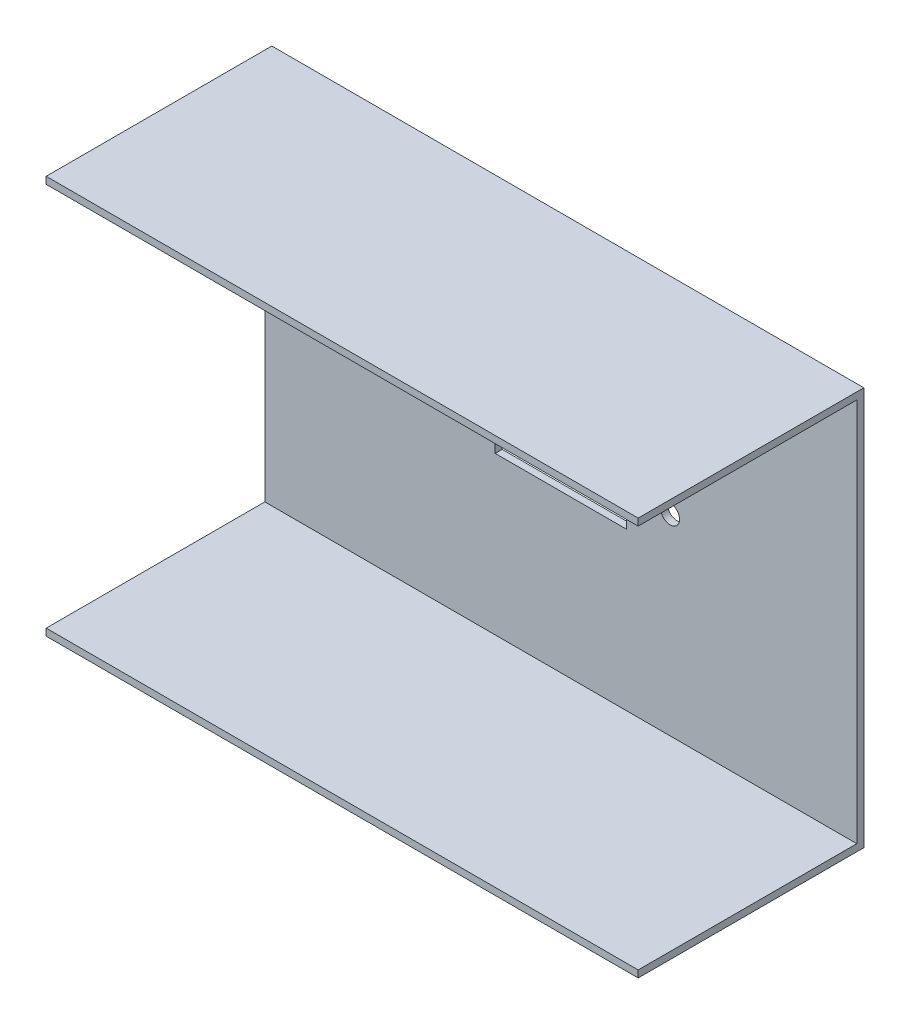
ISO-10303-21;
HEADER;
FILE_DESCRIPTION(('STEP AP214'),'2;1');
FILE_NAME('part.step','',(''),(''),'','','');
FILE_SCHEMA(('AUTOMOTIVE_DESIGN { 1 0 10303 214 1 1 1 1 }'));
ENDSEC;
DATA;
#1=APPLICATION_CONTEXT('core data for automotive mechanical design processes');
#2=APPLICATION_PROTOCOL_DEFINITION('international standard','automotive_design',2000,#1);
#3=PRODUCT_CONTEXT('',#1,'mechanical');
#4=PRODUCT('Part','Part','',(#3));
#5=PRODUCT_RELATED_PRODUCT_CATEGORY('part','',(#4));
#6=PRODUCT_DEFINITION_FORMATION('','',#4);
#7=PRODUCT_DEFINITION_CONTEXT('part definition',#1,'design');
#8=PRODUCT_DEFINITION('design','',#6,#7);
#9=PRODUCT_DEFINITION_SHAPE('','',#8);
#10=(LENGTH_UNIT() NAMED_UNIT(*) SI_UNIT(.MILLI.,.METRE.));
#11=(NAMED_UNIT(*) PLANE_ANGLE_UNIT() SI_UNIT($,.RADIAN.));
#12=(NAMED_UNIT(*) SI_UNIT($,.STERADIAN.) SOLID_ANGLE_UNIT());
#13=UNCERTAINTY_MEASURE_WITH_UNIT(LENGTH_MEASURE(1.E-05),#10,'distance_accuracy_value','');
#14=(GEOMETRIC_REPRESENTATION_CONTEXT(3) GLOBAL_UNCERTAINTY_ASSIGNED_CONTEXT((#13)) GLOBAL_UNIT_ASSIGNED_CONTEXT((#10,
#11,#12)) REPRESENTATION_CONTEXT('',''));
#15=CARTESIAN_POINT('',(0.,0.,0.));
#16=DIRECTION('',(0.,0.,1.));
#17=DIRECTION('',(1.,0.,0.));
#18=AXIS2_PLACEMENT_3D('',#15,#16,#17);
#19=CARTESIAN_POINT('',(135.3879,0.,-51.6002));
#20=DIRECTION('',(0.,-1.,0.));
#21=DIRECTION('',(0.,0.,-1.));
#22=AXIS2_PLACEMENT_3D('',#19,#20,#21);
#23=PLANE('',#22);
#24=DIRECTION('',(0.,0.,1.));
#25=VECTOR('',#24,1.);
#26=CARTESIAN_POINT('',(0.,0.,-51.6002));
#27=LINE('',#26,#25);
#28=CARTESIAN_POINT('',(0.,0.,-51.6002));
#29=VERTEX_POINT('',#28);
#30=CARTESIAN_POINT('',(0.,0.,0.));
#31=VERTEX_POINT('',#30);
#32=EDGE_CURVE('E159',#29,#31,#27,.T.);
#33=ORIENTED_EDGE('',*,*,#32,.T.);
#34=DIRECTION('',(-1.,0.,0.));
#35=VECTOR('',#34,1.);
#36=CARTESIAN_POINT('',(135.3879,0.,0.));
#37=LINE('',#36,#35);
#38=CARTESIAN_POINT('',(135.3879,0.,0.));
#39=VERTEX_POINT('',#38);
#40=EDGE_CURVE('E11',#39,#31,#37,.T.);
#41=ORIENTED_EDGE('',*,*,#40,.F.);
#42=DIRECTION('',(0.,0.,1.));
#43=VECTOR('',#42,1.);
#44=CARTESIAN_POINT('',(135.3879,0.,-51.6002));
#45=LINE('',#44,#43);
#46=CARTESIAN_POINT('',(135.3879,0.,-51.6002));
#47=VERTEX_POINT('',#46);
#48=EDGE_CURVE('E161',#47,#39,#45,.T.);
#49=ORIENTED_EDGE('',*,*,#48,.F.);
#50=DIRECTION('',(-1.,0.,0.));
#51=VECTOR('',#50,1.);
#52=CARTESIAN_POINT('',(135.3879,0.,-51.6002));
#53=LINE('',#52,#51);
#54=EDGE_CURVE('E179',#47,#29,#53,.T.);
#55=ORIENTED_EDGE('',*,*,#54,.T.);
#56=EDGE_LOOP('',(#33,#41,#49,#55));
#57=FACE_BOUND('',#56,.T.);
#58=ADVANCED_FACE('F41',(#57),#23,.F.);
#59=CARTESIAN_POINT('',(135.3879,0.,0.));
#60=DIRECTION('',(0.,0.,-1.));
#61=DIRECTION('',(0.,1.,0.));
#62=AXIS2_PLACEMENT_3D('',#59,#60,#61);
#63=PLANE('',#62);
#64=DIRECTION('',(0.,-1.,0.));
#65=VECTOR('',#64,1.);
#66=CARTESIAN_POINT('',(0.,0.,0.));
#67=LINE('',#66,#65);
#68=CARTESIAN_POINT('',(0.,-1.6002,0.));
#69=VERTEX_POINT('',#68);
#70=EDGE_CURVE('E182',#31,#69,#67,.T.);
#71=ORIENTED_EDGE('',*,*,#70,.T.);
#72=DIRECTION('',(-1.,0.,0.));
#73=VECTOR('',#72,1.);
#74=CARTESIAN_POINT('',(135.3879,-1.6002,0.));
#75=LINE('',#74,#73);
#76=CARTESIAN_POINT('',(135.3879,-1.6002,0.));
#77=VERTEX_POINT('',#76);
#78=EDGE_CURVE('E48',#77,#69,#75,.T.);
#79=ORIENTED_EDGE('',*,*,#78,.F.);
#80=DIRECTION('',(0.,-1.,0.));
#81=VECTOR('',#80,1.);
#82=CARTESIAN_POINT('',(135.3879,0.,0.));
#83=LINE('',#82,#81);
#84=EDGE_CURVE('E164',#39,#77,#83,.T.);
#85=ORIENTED_EDGE('',*,*,#84,.F.);
#86=ORIENTED_EDGE('',*,*,#40,.T.);
#87=EDGE_LOOP('',(#71,#79,#85,#86));
#88=FACE_BOUND('',#87,.T.);
#89=ADVANCED_FACE('F237',(#88),#63,.F.);
#90=CARTESIAN_POINT('',(135.3879,-1.6002,0.));
#91=DIRECTION('',(0.,1.,0.));
#92=DIRECTION('',(0.,0.,1.));
#93=AXIS2_PLACEMENT_3D('',#90,#91,#92);
#94=PLANE('',#93);
#95=DIRECTION('',(0.,0.,-1.));
#96=VECTOR('',#95,1.);
#97=CARTESIAN_POINT('',(0.,-1.6002,0.));
#98=LINE('',#97,#96);
#99=CARTESIAN_POINT('',(0.,-1.6002,-50.));
#100=VERTEX_POINT('',#99);
#101=EDGE_CURVE('E184',#69,#100,#98,.T.);
#102=ORIENTED_EDGE('',*,*,#101,.T.);
#103=DIRECTION('',(-1.,0.,0.));
#104=VECTOR('',#103,1.);
#105=CARTESIAN_POINT('',(135.3879,-1.6002,-50.));
#106=LINE('',#105,#104);
#107=CARTESIAN_POINT('',(135.3879,-1.6002,-50.));
#108=VERTEX_POINT('',#107);
#109=EDGE_CURVE('E209',#108,#100,#106,.T.);
#110=ORIENTED_EDGE('',*,*,#109,.F.);
#111=DIRECTION('',(0.,0.,-1.));
#112=VECTOR('',#111,1.);
#113=CARTESIAN_POINT('',(135.3879,-1.6002,0.));
#114=LINE('',#113,#112);
#115=EDGE_CURVE('E167',#77,#108,#114,.T.);
#116=ORIENTED_EDGE('',*,*,#115,.F.);
#117=ORIENTED_EDGE('',*,*,#78,.T.);
#118=EDGE_LOOP('',(#102,#110,#116,#117));
#119=FACE_BOUND('',#118,.T.);
#120=ADVANCED_FACE('F216',(#119),#94,.F.);
#121=CARTESIAN_POINT('',(135.3879,-1.6002,-50.));
#122=DIRECTION('',(0.,0.,-1.));
#123=DIRECTION('',(0.,1.,0.));
#124=AXIS2_PLACEMENT_3D('',#121,#122,#123);
#125=PLANE('',#124);
#126=CARTESIAN_POINT('',(92.69395,-45.54554,-50.));
#127=DIRECTION('',(0.,0.,1.));
#128=DIRECTION('',(1.,0.,0.));
#129=AXIS2_PLACEMENT_3D('',#126,#127,#128);
#130=CIRCLE('',#129,2.15500000000001);
#131=CARTESIAN_POINT('',(94.84895,-45.54554,-50.));
#132=VERTEX_POINT('',#131);
#133=EDGE_CURVE('E275',#132,#132,#130,.T.);
#134=ORIENTED_EDGE('',*,*,#133,.F.);
#135=EDGE_LOOP('',(#134));
#136=FACE_BOUND('',#135,.T.);
#137=CARTESIAN_POINT('',(42.69395,-45.54554,-50.));
#138=DIRECTION('',(0.,0.,1.));
#139=DIRECTION('',(1.,0.,0.));
#140=AXIS2_PLACEMENT_3D('',#137,#138,#139);
#141=CIRCLE('',#140,2.15499999999999);
#142=CARTESIAN_POINT('',(44.84895,-45.54554,-50.));
#143=VERTEX_POINT('',#142);
#144=EDGE_CURVE('E279',#143,#143,#141,.T.);
#145=ORIENTED_EDGE('',*,*,#144,.F.);
#146=EDGE_LOOP('',(#145));
#147=FACE_BOUND('',#146,.T.);
#148=CARTESIAN_POINT('',(92.69395,-25.54554,-50.));
#149=DIRECTION('',(0.,0.,1.));
#150=DIRECTION('',(1.,0.,0.));
#151=AXIS2_PLACEMENT_3D('',#148,#149,#150);
#152=CIRCLE('',#151,2.15500000000001);
#153=CARTESIAN_POINT('',(94.84895,-25.54554,-50.));
#154=VERTEX_POINT('',#153);
#155=EDGE_CURVE('E283',#154,#154,#152,.T.);
#156=ORIENTED_EDGE('',*,*,#155,.F.);
#157=EDGE_LOOP('',(#156));
#158=FACE_BOUND('',#157,.T.);
#159=CARTESIAN_POINT('',(42.69395,-25.54554,-50.));
#160=DIRECTION('',(0.,0.,1.));
#161=DIRECTION('',(1.,0.,0.));
#162=AXIS2_PLACEMENT_3D('',#159,#160,#161);
#163=CIRCLE('',#162,2.155);
#164=CARTESIAN_POINT('',(44.84895,-25.54554,-50.));
#165=VERTEX_POINT('',#164);
#166=EDGE_CURVE('E286',#165,#165,#163,.T.);
#167=ORIENTED_EDGE('',*,*,#166,.F.);
#168=EDGE_LOOP('',(#167));
#169=FACE_BOUND('',#168,.T.);
#170=DIRECTION('',(1.,0.,0.));
#171=VECTOR('',#170,1.);
#172=CARTESIAN_POINT('',(52.69395,-53.54554,-50.));
#173=LINE('',#172,#171);
#174=CARTESIAN_POINT('',(52.69395,-53.54554,-50.));
#175=VERTEX_POINT('',#174);
#176=CARTESIAN_POINT('',(82.69395,-53.54554,-50.));
#177=VERTEX_POINT('',#176);
#178=EDGE_CURVE('E141',#175,#177,#173,.T.);
#179=ORIENTED_EDGE('',*,*,#178,.F.);
#180=DIRECTION('',(0.,-1.,0.));
#181=VECTOR('',#180,1.);
#182=CARTESIAN_POINT('',(52.69395,-33.54554,-50.));
#183=LINE('',#182,#181);
#184=CARTESIAN_POINT('',(52.69395,-33.54554,-50.));
#185=VERTEX_POINT('',#184);
#186=EDGE_CURVE('E55',#185,#175,#183,.T.);
#187=ORIENTED_EDGE('',*,*,#186,.F.);
#188=DIRECTION('',(-1.,0.,0.));
#189=VECTOR('',#188,1.);
#190=CARTESIAN_POINT('',(52.69395,-33.54554,-50.));
#191=LINE('',#190,#189);
#192=CARTESIAN_POINT('',(82.69395,-33.54554,-50.));
#193=VERTEX_POINT('',#192);
#194=EDGE_CURVE('E148',#193,#185,#191,.T.);
#195=ORIENTED_EDGE('',*,*,#194,.F.);
#196=DIRECTION('',(0.,1.,0.));
#197=VECTOR('',#196,1.);
#198=CARTESIAN_POINT('',(82.69395,-33.54554,-50.));
#199=LINE('',#198,#197);
#200=EDGE_CURVE('E132',#177,#193,#199,.T.);
#201=ORIENTED_EDGE('',*,*,#200,.F.);
#202=EDGE_LOOP('',(#179,#187,#195,#201));
#203=FACE_BOUND('',#202,.T.);
#204=DIRECTION('',(0.,-1.,0.));
#205=VECTOR('',#204,1.);
#206=CARTESIAN_POINT('',(0.,-1.6002,-50.));
#207=LINE('',#206,#205);
#208=CARTESIAN_POINT('',(0.,-89.49088,-50.));
#209=VERTEX_POINT('',#208);
#210=EDGE_CURVE('E186',#100,#209,#207,.T.);
#211=ORIENTED_EDGE('',*,*,#210,.T.);
#212=DIRECTION('',(-1.,0.,0.));
#213=VECTOR('',#212,1.);
#214=CARTESIAN_POINT('',(135.3879,-89.49088,-50.));
#215=LINE('',#214,#213);
#216=CARTESIAN_POINT('',(135.3879,-89.49088,-50.));
#217=VERTEX_POINT('',#216);
#218=EDGE_CURVE('E206',#217,#209,#215,.T.);
#219=ORIENTED_EDGE('',*,*,#218,.F.);
#220=DIRECTION('',(0.,-1.,0.));
#221=VECTOR('',#220,1.);
#222=CARTESIAN_POINT('',(135.3879,-1.6002,-50.));
#223=LINE('',#222,#221);
#224=EDGE_CURVE('E169',#108,#217,#223,.T.);
#225=ORIENTED_EDGE('',*,*,#224,.F.);
#226=ORIENTED_EDGE('',*,*,#109,.T.);
#227=EDGE_LOOP('',(#211,#219,#225,#226));
#228=FACE_BOUND('',#227,.T.);
#229=ADVANCED_FACE('F145',(#136,#147,#158,#169,#203,#228),#125,.F.);
#230=CARTESIAN_POINT('',(135.3879,-89.49088,-50.));
#231=DIRECTION('',(0.,-1.,0.));
#232=DIRECTION('',(0.,0.,-1.));
#233=AXIS2_PLACEMENT_3D('',#230,#231,#232);
#234=PLANE('',#233);
#235=DIRECTION('',(0.,0.,1.));
#236=VECTOR('',#235,1.);
#237=CARTESIAN_POINT('',(0.,-89.49088,-50.));
#238=LINE('',#237,#236);
#239=CARTESIAN_POINT('',(0.,-89.49088,0.));
#240=VERTEX_POINT('',#239);
#241=EDGE_CURVE('E188',#209,#240,#238,.T.);
#242=ORIENTED_EDGE('',*,*,#241,.T.);
#243=DIRECTION('',(-1.,0.,0.));
#244=VECTOR('',#243,1.);
#245=CARTESIAN_POINT('',(135.3879,-89.49088,0.));
#246=LINE('',#245,#244);
#247=CARTESIAN_POINT('',(135.3879,-89.49088,0.));
#248=VERTEX_POINT('',#247);
#249=EDGE_CURVE('E203',#248,#240,#246,.T.);
#250=ORIENTED_EDGE('',*,*,#249,.F.);
#251=DIRECTION('',(0.,0.,1.));
#252=VECTOR('',#251,1.);
#253=CARTESIAN_POINT('',(135.3879,-89.49088,-50.));
#254=LINE('',#253,#252);
#255=EDGE_CURVE('E171',#217,#248,#254,.T.);
#256=ORIENTED_EDGE('',*,*,#255,.F.);
#257=ORIENTED_EDGE('',*,*,#218,.T.);
#258=EDGE_LOOP('',(#242,#250,#256,#257));
#259=FACE_BOUND('',#258,.T.);
#260=ADVANCED_FACE('F229',(#259),#234,.F.);
#261=CARTESIAN_POINT('',(135.3879,-89.49088,0.));
#262=DIRECTION('',(0.,0.,-1.));
#263=DIRECTION('',(0.,1.,0.));
#264=AXIS2_PLACEMENT_3D('',#261,#262,#263);
#265=PLANE('',#264);
#266=DIRECTION('',(0.,-1.,0.));
#267=VECTOR('',#266,1.);
#268=CARTESIAN_POINT('',(0.,-89.49088,0.));
#269=LINE('',#268,#267);
#270=CARTESIAN_POINT('',(0.,-91.09108,0.));
#271=VERTEX_POINT('',#270);
#272=EDGE_CURVE('E190',#240,#271,#269,.T.);
#273=ORIENTED_EDGE('',*,*,#272,.T.);
#274=DIRECTION('',(-1.,0.,0.));
#275=VECTOR('',#274,1.);
#276=CARTESIAN_POINT('',(135.3879,-91.09108,0.));
#277=LINE('',#276,#275);
#278=CARTESIAN_POINT('',(135.3879,-91.09108,0.));
#279=VERTEX_POINT('',#278);
#280=EDGE_CURVE('E200',#279,#271,#277,.T.);
#281=ORIENTED_EDGE('',*,*,#280,.F.);
#282=DIRECTION('',(0.,-1.,0.));
#283=VECTOR('',#282,1.);
#284=CARTESIAN_POINT('',(135.3879,-89.49088,0.));
#285=LINE('',#284,#283);
#286=EDGE_CURVE('E173',#248,#279,#285,.T.);
#287=ORIENTED_EDGE('',*,*,#286,.F.);
#288=ORIENTED_EDGE('',*,*,#249,.T.);
#289=EDGE_LOOP('',(#273,#281,#287,#288));
#290=FACE_BOUND('',#289,.T.);
#291=ADVANCED_FACE('F250',(#290),#265,.F.);
#292=CARTESIAN_POINT('',(135.3879,-91.09108,0.));
#293=DIRECTION('',(0.,1.,0.));
#294=DIRECTION('',(0.,0.,1.));
#295=AXIS2_PLACEMENT_3D('',#292,#293,#294);
#296=PLANE('',#295);
#297=DIRECTION('',(0.,0.,-1.));
#298=VECTOR('',#297,1.);
#299=CARTESIAN_POINT('',(0.,-91.09108,0.));
#300=LINE('',#299,#298);
#301=CARTESIAN_POINT('',(0.,-91.09108,-51.6002));
#302=VERTEX_POINT('',#301);
#303=EDGE_CURVE('E192',#271,#302,#300,.T.);
#304=ORIENTED_EDGE('',*,*,#303,.T.);
#305=DIRECTION('',(-1.,0.,0.));
#306=VECTOR('',#305,1.);
#307=CARTESIAN_POINT('',(135.3879,-91.09108,-51.6002));
#308=LINE('',#307,#306);
#309=CARTESIAN_POINT('',(135.3879,-91.09108,-51.6002));
#310=VERTEX_POINT('',#309);
#311=EDGE_CURVE('E197',#310,#302,#308,.T.);
#312=ORIENTED_EDGE('',*,*,#311,.F.);
#313=DIRECTION('',(0.,0.,-1.));
#314=VECTOR('',#313,1.);
#315=CARTESIAN_POINT('',(135.3879,-91.09108,0.));
#316=LINE('',#315,#314);
#317=EDGE_CURVE('E175',#279,#310,#316,.T.);
#318=ORIENTED_EDGE('',*,*,#317,.F.);
#319=ORIENTED_EDGE('',*,*,#280,.T.);
#320=EDGE_LOOP('',(#304,#312,#318,#319));
#321=FACE_BOUND('',#320,.T.);
#322=ADVANCED_FACE('F248',(#321),#296,.F.);
#323=CARTESIAN_POINT('',(135.3879,-91.09108,-51.6002));
#324=DIRECTION('',(0.,0.,1.));
#325=DIRECTION('',(0.,-1.,0.));
#326=AXIS2_PLACEMENT_3D('',#323,#324,#325);
#327=PLANE('',#326);
#328=CARTESIAN_POINT('',(92.69395,-45.54554,-51.6002));
#329=DIRECTION('',(0.,0.,1.));
#330=DIRECTION('',(0.,-1.,0.));
#331=AXIS2_PLACEMENT_3D('',#328,#329,#330);
#332=CIRCLE('',#331,2.15500000000001);
#333=CARTESIAN_POINT('',(92.69395,-47.70054,-51.6002));
#334=VERTEX_POINT('',#333);
#335=EDGE_CURVE('E301',#334,#334,#332,.F.);
#336=ORIENTED_EDGE('',*,*,#335,.F.);
#337=EDGE_LOOP('',(#336));
#338=FACE_BOUND('',#337,.T.);
#339=CARTESIAN_POINT('',(42.69395,-45.54554,-51.6002));
#340=DIRECTION('',(0.,0.,1.));
#341=DIRECTION('',(0.,-1.,0.));
#342=AXIS2_PLACEMENT_3D('',#339,#340,#341);
#343=CIRCLE('',#342,2.15499999999999);
#344=CARTESIAN_POINT('',(42.69395,-47.70054,-51.6002));
#345=VERTEX_POINT('',#344);
#346=EDGE_CURVE('E297',#345,#345,#343,.F.);
#347=ORIENTED_EDGE('',*,*,#346,.F.);
#348=EDGE_LOOP('',(#347));
#349=FACE_BOUND('',#348,.T.);
#350=CARTESIAN_POINT('',(92.69395,-25.54554,-51.6002));
#351=DIRECTION('',(0.,0.,1.));
#352=DIRECTION('',(0.,-1.,0.));
#353=AXIS2_PLACEMENT_3D('',#350,#351,#352);
#354=CIRCLE('',#353,2.15500000000001);
#355=CARTESIAN_POINT('',(92.69395,-27.70054,-51.6002));
#356=VERTEX_POINT('',#355);
#357=EDGE_CURVE('E293',#356,#356,#354,.F.);
#358=ORIENTED_EDGE('',*,*,#357,.F.);
#359=EDGE_LOOP('',(#358));
#360=FACE_BOUND('',#359,.T.);
#361=CARTESIAN_POINT('',(42.69395,-25.54554,-51.6002));
#362=DIRECTION('',(0.,0.,1.));
#363=DIRECTION('',(0.,-1.,0.));
#364=AXIS2_PLACEMENT_3D('',#361,#362,#363);
#365=CIRCLE('',#364,2.155);
#366=CARTESIAN_POINT('',(42.69395,-27.70054,-51.6002));
#367=VERTEX_POINT('',#366);
#368=EDGE_CURVE('E288',#367,#367,#365,.F.);
#369=ORIENTED_EDGE('',*,*,#368,.F.);
#370=EDGE_LOOP('',(#369));
#371=FACE_BOUND('',#370,.T.);
#372=DIRECTION('',(1.,0.,0.));
#373=VECTOR('',#372,1.);
#374=CARTESIAN_POINT('',(52.69395,-33.54554,-51.6002));
#375=LINE('',#374,#373);
#376=CARTESIAN_POINT('',(52.69395,-33.54554,-51.6002));
#377=VERTEX_POINT('',#376);
#378=CARTESIAN_POINT('',(82.69395,-33.54554,-51.6002));
#379=VERTEX_POINT('',#378);
#380=EDGE_CURVE('E306',#377,#379,#375,.T.);
#381=ORIENTED_EDGE('',*,*,#380,.F.);
#382=DIRECTION('',(0.,1.,0.));
#383=VECTOR('',#382,1.);
#384=CARTESIAN_POINT('',(52.69395,-33.54554,-51.6002));
#385=LINE('',#384,#383);
#386=CARTESIAN_POINT('',(52.69395,-53.54554,-51.6002));
#387=VERTEX_POINT('',#386);
#388=EDGE_CURVE('E160',#387,#377,#385,.T.);
#389=ORIENTED_EDGE('',*,*,#388,.F.);
#390=DIRECTION('',(-1.,0.,0.));
#391=VECTOR('',#390,1.);
#392=CARTESIAN_POINT('',(52.69395,-53.54554,-51.6002));
#393=LINE('',#392,#391);
#394=CARTESIAN_POINT('',(82.69395,-53.54554,-51.6002));
#395=VERTEX_POINT('',#394);
#396=EDGE_CURVE('E157',#395,#387,#393,.T.);
#397=ORIENTED_EDGE('',*,*,#396,.F.);
#398=DIRECTION('',(0.,-1.,0.));
#399=VECTOR('',#398,1.);
#400=CARTESIAN_POINT('',(82.69395,-33.54554,-51.6002));
#401=LINE('',#400,#399);
#402=EDGE_CURVE('E135',#379,#395,#401,.T.);
#403=ORIENTED_EDGE('',*,*,#402,.F.);
#404=EDGE_LOOP('',(#381,#389,#397,#403));
#405=FACE_BOUND('',#404,.T.);
#406=DIRECTION('',(0.,1.,0.));
#407=VECTOR('',#406,1.);
#408=CARTESIAN_POINT('',(0.,-91.09108,-51.6002));
#409=LINE('',#408,#407);
#410=EDGE_CURVE('E165',#302,#29,#409,.T.);
#411=ORIENTED_EDGE('',*,*,#410,.T.);
#412=ORIENTED_EDGE('',*,*,#54,.F.);
#413=DIRECTION('',(0.,1.,0.));
#414=VECTOR('',#413,1.);
#415=CARTESIAN_POINT('',(135.3879,-91.09108,-51.6002));
#416=LINE('',#415,#414);
#417=EDGE_CURVE('E177',#310,#47,#416,.T.);
#418=ORIENTED_EDGE('',*,*,#417,.F.);
#419=ORIENTED_EDGE('',*,*,#311,.T.);
#420=EDGE_LOOP('',(#411,#412,#418,#419));
#421=FACE_BOUND('',#420,.T.);
#422=ADVANCED_FACE('F243',(#338,#349,#360,#371,#405,#421),#327,.F.);
#423=CARTESIAN_POINT('',(135.3879,0.,0.));
#424=DIRECTION('',(1.,0.,0.));
#425=DIRECTION('',(0.,0.,-1.));
#426=AXIS2_PLACEMENT_3D('',#423,#424,#425);
#427=PLANE('',#426);
#428=ORIENTED_EDGE('',*,*,#48,.T.);
#429=ORIENTED_EDGE('',*,*,#84,.T.);
#430=ORIENTED_EDGE('',*,*,#115,.T.);
#431=ORIENTED_EDGE('',*,*,#224,.T.);
#432=ORIENTED_EDGE('',*,*,#255,.T.);
#433=ORIENTED_EDGE('',*,*,#286,.T.);
#434=ORIENTED_EDGE('',*,*,#317,.T.);
#435=ORIENTED_EDGE('',*,*,#417,.T.);
#436=EDGE_LOOP('',(#428,#429,#430,#431,#432,#433,#434,#435));
#437=FACE_BOUND('',#436,.T.);
#438=ADVANCED_FACE('F233',(#437),#427,.T.);
#439=CARTESIAN_POINT('',(0.,0.,0.));
#440=DIRECTION('',(1.,0.,0.));
#441=DIRECTION('',(0.,0.,-1.));
#442=AXIS2_PLACEMENT_3D('',#439,#440,#441);
#443=PLANE('',#442);
#444=ORIENTED_EDGE('',*,*,#32,.F.);
#445=ORIENTED_EDGE('',*,*,#410,.F.);
#446=ORIENTED_EDGE('',*,*,#303,.F.);
#447=ORIENTED_EDGE('',*,*,#272,.F.);
#448=ORIENTED_EDGE('',*,*,#241,.F.);
#449=ORIENTED_EDGE('',*,*,#210,.F.);
#450=ORIENTED_EDGE('',*,*,#101,.F.);
#451=ORIENTED_EDGE('',*,*,#70,.F.);
#452=EDGE_LOOP('',(#444,#445,#446,#447,#448,#449,#450,#451));
#453=FACE_BOUND('',#452,.T.);
#454=ADVANCED_FACE('F222',(#453),#443,.F.);
#455=CARTESIAN_POINT('',(52.69395,-33.54554,-87.6557127546399));
#456=DIRECTION('',(-1.,0.,0.));
#457=DIRECTION('',(0.,-1.,0.));
#458=AXIS2_PLACEMENT_3D('',#455,#456,#457);
#459=PLANE('',#458);
#460=ORIENTED_EDGE('',*,*,#388,.T.);
#461=DIRECTION('',(0.,0.,1.));
#462=VECTOR('',#461,1.);
#463=CARTESIAN_POINT('',(52.69395,-33.54554,-87.6557127546399));
#464=LINE('',#463,#462);
#465=EDGE_CURVE('E153',#377,#185,#464,.T.);
#466=ORIENTED_EDGE('',*,*,#465,.T.);
#467=ORIENTED_EDGE('',*,*,#186,.T.);
#468=DIRECTION('',(0.,0.,1.));
#469=VECTOR('',#468,1.);
#470=CARTESIAN_POINT('',(52.69395,-53.54554,-87.6557127546399));
#471=LINE('',#470,#469);
#472=EDGE_CURVE('E138',#387,#175,#471,.T.);
#473=ORIENTED_EDGE('',*,*,#472,.F.);
#474=EDGE_LOOP('',(#460,#466,#467,#473));
#475=FACE_BOUND('',#474,.T.);
#476=ADVANCED_FACE('F310',(#475),#459,.F.);
#477=CARTESIAN_POINT('',(52.69395,-33.54554,-87.6557127546399));
#478=DIRECTION('',(0.,1.,0.));
#479=DIRECTION('',(-1.,0.,0.));
#480=AXIS2_PLACEMENT_3D('',#477,#478,#479);
#481=PLANE('',#480);
#482=ORIENTED_EDGE('',*,*,#380,.T.);
#483=DIRECTION('',(0.,0.,1.));
#484=VECTOR('',#483,1.);
#485=CARTESIAN_POINT('',(82.69395,-33.54554,-87.6557127546399));
#486=LINE('',#485,#484);
#487=EDGE_CURVE('E137',#379,#193,#486,.T.);
#488=ORIENTED_EDGE('',*,*,#487,.T.);
#489=ORIENTED_EDGE('',*,*,#194,.T.);
#490=ORIENTED_EDGE('',*,*,#465,.F.);
#491=EDGE_LOOP('',(#482,#488,#489,#490));
#492=FACE_BOUND('',#491,.T.);
#493=ADVANCED_FACE('F314',(#492),#481,.F.);
#494=CARTESIAN_POINT('',(82.69395,-33.54554,-87.6557127546399));
#495=DIRECTION('',(1.,0.,0.));
#496=DIRECTION('',(0.,0.,-1.));
#497=AXIS2_PLACEMENT_3D('',#494,#495,#496);
#498=PLANE('',#497);
#499=ORIENTED_EDGE('',*,*,#402,.T.);
#500=DIRECTION('',(0.,0.,1.));
#501=VECTOR('',#500,1.);
#502=CARTESIAN_POINT('',(82.69395,-53.54554,-87.6557127546399));
#503=LINE('',#502,#501);
#504=EDGE_CURVE('E63',#395,#177,#503,.T.);
#505=ORIENTED_EDGE('',*,*,#504,.T.);
#506=ORIENTED_EDGE('',*,*,#200,.T.);
#507=ORIENTED_EDGE('',*,*,#487,.F.);
#508=EDGE_LOOP('',(#499,#505,#506,#507));
#509=FACE_BOUND('',#508,.T.);
#510=ADVANCED_FACE('F129',(#509),#498,.F.);
#511=CARTESIAN_POINT('',(52.69395,-53.54554,-87.6557127546399));
#512=DIRECTION('',(0.,-1.,0.));
#513=DIRECTION('',(0.,0.,-1.));
#514=AXIS2_PLACEMENT_3D('',#511,#512,#513);
#515=PLANE('',#514);
#516=ORIENTED_EDGE('',*,*,#396,.T.);
#517=ORIENTED_EDGE('',*,*,#472,.T.);
#518=ORIENTED_EDGE('',*,*,#178,.T.);
#519=ORIENTED_EDGE('',*,*,#504,.F.);
#520=EDGE_LOOP('',(#516,#517,#518,#519));
#521=FACE_BOUND('',#520,.T.);
#522=ADVANCED_FACE('F142',(#521),#515,.F.);
#523=CARTESIAN_POINT('',(42.69395,-25.54554,-87.6557127546399));
#524=DIRECTION('',(0.,0.,1.));
#525=DIRECTION('',(1.,0.,0.));
#526=AXIS2_PLACEMENT_3D('',#523,#524,#525);
#527=CYLINDRICAL_SURFACE('',#526,2.155);
#528=ORIENTED_EDGE('',*,*,#368,.T.);
#529=EDGE_LOOP('',(#528));
#530=FACE_BOUND('',#529,.T.);
#531=ORIENTED_EDGE('',*,*,#166,.T.);
#532=EDGE_LOOP('',(#531));
#533=FACE_BOUND('',#532,.T.);
#534=ADVANCED_FACE('F331',(#530,#533),#527,.F.);
#535=CARTESIAN_POINT('',(92.69395,-25.54554,-87.6557127546399));
#536=DIRECTION('',(0.,0.,1.));
#537=DIRECTION('',(1.,0.,0.));
#538=AXIS2_PLACEMENT_3D('',#535,#536,#537);
#539=CYLINDRICAL_SURFACE('',#538,2.15500000000001);
#540=ORIENTED_EDGE('',*,*,#357,.T.);
#541=EDGE_LOOP('',(#540));
#542=FACE_BOUND('',#541,.T.);
#543=ORIENTED_EDGE('',*,*,#155,.T.);
#544=EDGE_LOOP('',(#543));
#545=FACE_BOUND('',#544,.T.);
#546=ADVANCED_FACE('F343',(#542,#545),#539,.F.);
#547=CARTESIAN_POINT('',(42.69395,-45.54554,-87.6557127546399));
#548=DIRECTION('',(0.,0.,1.));
#549=DIRECTION('',(1.,0.,0.));
#550=AXIS2_PLACEMENT_3D('',#547,#548,#549);
#551=CYLINDRICAL_SURFACE('',#550,2.15499999999999);
#552=ORIENTED_EDGE('',*,*,#346,.T.);
#553=EDGE_LOOP('',(#552));
#554=FACE_BOUND('',#553,.T.);
#555=ORIENTED_EDGE('',*,*,#144,.T.);
#556=EDGE_LOOP('',(#555));
#557=FACE_BOUND('',#556,.T.);
#558=ADVANCED_FACE('F339',(#554,#557),#551,.F.);
#559=CARTESIAN_POINT('',(92.69395,-45.54554,-87.6557127546399));
#560=DIRECTION('',(0.,0.,1.));
#561=DIRECTION('',(1.,0.,0.));
#562=AXIS2_PLACEMENT_3D('',#559,#560,#561);
#563=CYLINDRICAL_SURFACE('',#562,2.15500000000001);
#564=ORIENTED_EDGE('',*,*,#335,.T.);
#565=EDGE_LOOP('',(#564));
#566=FACE_BOUND('',#565,.T.);
#567=ORIENTED_EDGE('',*,*,#133,.T.);
#568=EDGE_LOOP('',(#567));
#569=FACE_BOUND('',#568,.T.);
#570=ADVANCED_FACE('F336',(#566,#569),#563,.F.);
#571=CLOSED_SHELL('',(#58,#89,#120,#229,#260,#291,#322,#422,#438,#454,#476,#493,#510,#522,#534,
#546,#558,#570));
#572=MANIFOLD_SOLID_BREP('B2',#571);
#573=ADVANCED_BREP_SHAPE_REPRESENTATION('',(#18,#572),#14);
#574=SHAPE_DEFINITION_REPRESENTATION(#9,#573);
ENDSEC;
END-ISO-10303-21;
